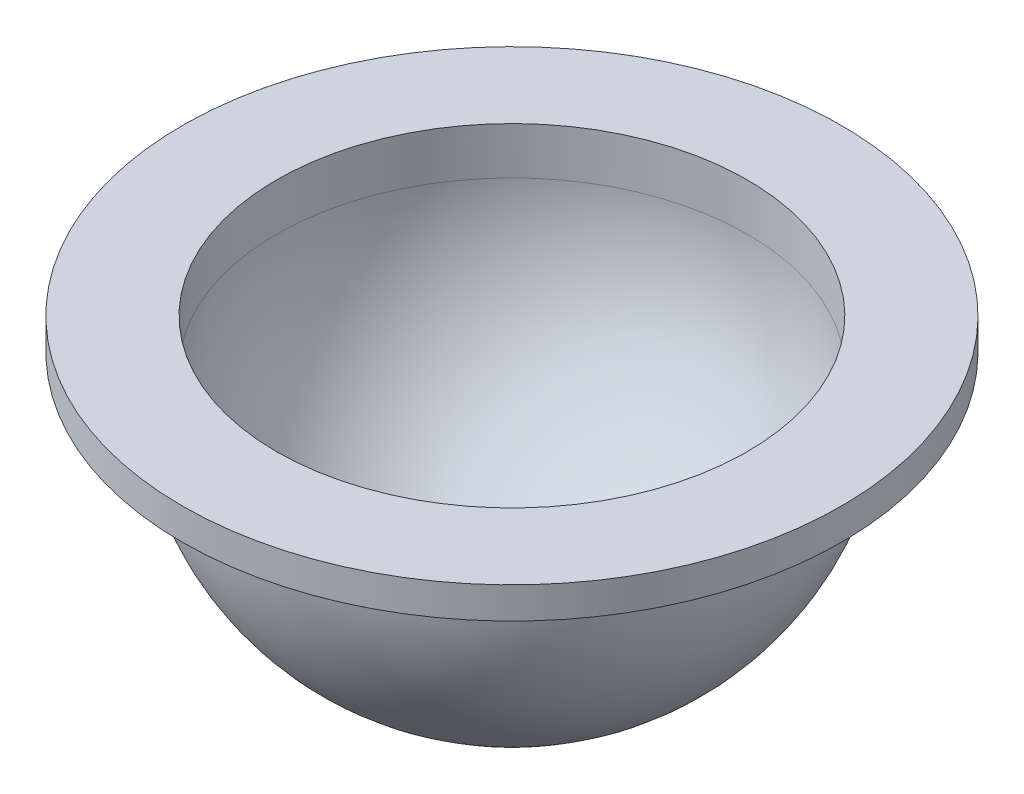
ISO-10303-21;
HEADER;
FILE_DESCRIPTION(('STEP AP214'),'2;1');
FILE_NAME('part.step','',(''),(''),'','','');
FILE_SCHEMA(('AUTOMOTIVE_DESIGN { 1 0 10303 214 1 1 1 1 }'));
ENDSEC;
DATA;
#1=APPLICATION_CONTEXT('core data for automotive mechanical design processes');
#2=APPLICATION_PROTOCOL_DEFINITION('international standard','automotive_design',2000,#1);
#3=PRODUCT_CONTEXT('',#1,'mechanical');
#4=PRODUCT('Part','Part','',(#3));
#5=PRODUCT_RELATED_PRODUCT_CATEGORY('part','',(#4));
#6=PRODUCT_DEFINITION_FORMATION('','',#4);
#7=PRODUCT_DEFINITION_CONTEXT('part definition',#1,'design');
#8=PRODUCT_DEFINITION('design','',#6,#7);
#9=PRODUCT_DEFINITION_SHAPE('','',#8);
#10=(LENGTH_UNIT() NAMED_UNIT(*) SI_UNIT(.MILLI.,.METRE.));
#11=(NAMED_UNIT(*) PLANE_ANGLE_UNIT() SI_UNIT($,.RADIAN.));
#12=(NAMED_UNIT(*) SI_UNIT($,.STERADIAN.) SOLID_ANGLE_UNIT());
#13=UNCERTAINTY_MEASURE_WITH_UNIT(LENGTH_MEASURE(1.E-05),#10,'distance_accuracy_value','');
#14=(GEOMETRIC_REPRESENTATION_CONTEXT(3) GLOBAL_UNCERTAINTY_ASSIGNED_CONTEXT((#13)) GLOBAL_UNIT_ASSIGNED_CONTEXT((#10,
#11,#12)) REPRESENTATION_CONTEXT('',''));
#15=CARTESIAN_POINT('',(0.,0.,0.));
#16=DIRECTION('',(0.,0.,1.));
#17=DIRECTION('',(1.,0.,0.));
#18=AXIS2_PLACEMENT_3D('',#15,#16,#17);
#19=CARTESIAN_POINT('',(0.,0.,-6.));
#20=DIRECTION('',(0.,1.,0.));
#21=DIRECTION('',(0.,0.,1.));
#22=AXIS2_PLACEMENT_3D('',#19,#20,#21);
#23=PLANE('',#22);
#24=CARTESIAN_POINT('',(0.,0.,-21.));
#25=DIRECTION('',(0.,1.,0.));
#26=DIRECTION('',(0.,0.,1.));
#27=AXIS2_PLACEMENT_3D('',#24,#25,#26);
#28=CIRCLE('',#27,21.);
#29=CARTESIAN_POINT('',(0.,0.,0.));
#30=VERTEX_POINT('',#29);
#31=EDGE_CURVE('E10',#30,#30,#28,.T.);
#32=ORIENTED_EDGE('',*,*,#31,.T.);
#33=EDGE_LOOP('',(#32));
#34=FACE_BOUND('',#33,.T.);
#35=CARTESIAN_POINT('',(0.,0.,-21.));
#36=DIRECTION('',(0.,1.,0.));
#37=DIRECTION('',(0.,0.,1.));
#38=AXIS2_PLACEMENT_3D('',#35,#36,#37);
#39=CIRCLE('',#38,15.);
#40=CARTESIAN_POINT('',(0.,0.,-6.));
#41=VERTEX_POINT('',#40);
#42=EDGE_CURVE('E61',#41,#41,#39,.T.);
#43=ORIENTED_EDGE('',*,*,#42,.F.);
#44=EDGE_LOOP('',(#43));
#45=FACE_BOUND('',#44,.T.);
#46=ADVANCED_FACE('F39',(#34,#45),#23,.T.);
#47=CARTESIAN_POINT('',(0.,28.1302952602436,-21.));
#48=DIRECTION('',(0.,1.,0.));
#49=DIRECTION('',(0.,0.,1.));
#50=AXIS2_PLACEMENT_3D('',#47,#48,#49);
#51=CYLINDRICAL_SURFACE('',#50,21.);
#52=CARTESIAN_POINT('',(0.,-2.,-21.));
#53=DIRECTION('',(0.,1.,0.));
#54=DIRECTION('',(0.,0.,1.));
#55=AXIS2_PLACEMENT_3D('',#52,#53,#54);
#56=CIRCLE('',#55,21.);
#57=CARTESIAN_POINT('',(0.,-2.,0.));
#58=VERTEX_POINT('',#57);
#59=EDGE_CURVE('E45',#58,#58,#56,.T.);
#60=ORIENTED_EDGE('',*,*,#59,.T.);
#61=EDGE_LOOP('',(#60));
#62=FACE_BOUND('',#61,.T.);
#63=ORIENTED_EDGE('',*,*,#31,.F.);
#64=EDGE_LOOP('',(#63));
#65=FACE_BOUND('',#64,.T.);
#66=ADVANCED_FACE('F69',(#62,#65),#51,.T.);
#67=CARTESIAN_POINT('',(0.,-2.,0.));
#68=DIRECTION('',(0.,-1.,0.));
#69=DIRECTION('',(0.,0.,-1.));
#70=AXIS2_PLACEMENT_3D('',#67,#68,#69);
#71=PLANE('',#70);
#72=CARTESIAN_POINT('',(0.,-2.,-21.));
#73=DIRECTION('',(0.,1.,0.));
#74=DIRECTION('',(0.,0.,1.));
#75=AXIS2_PLACEMENT_3D('',#72,#73,#74);
#76=CIRCLE('',#75,17.);
#77=CARTESIAN_POINT('',(0.,-2.,-4.));
#78=VERTEX_POINT('',#77);
#79=EDGE_CURVE('E49',#78,#78,#76,.T.);
#80=ORIENTED_EDGE('',*,*,#79,.T.);
#81=EDGE_LOOP('',(#80));
#82=FACE_BOUND('',#81,.T.);
#83=ORIENTED_EDGE('',*,*,#59,.F.);
#84=EDGE_LOOP('',(#83));
#85=FACE_BOUND('',#84,.T.);
#86=ADVANCED_FACE('F73',(#82,#85),#71,.T.);
#87=CARTESIAN_POINT('',(0.,28.1302952602436,-21.));
#88=DIRECTION('',(0.,1.,0.));
#89=DIRECTION('',(0.,0.,1.));
#90=AXIS2_PLACEMENT_3D('',#87,#88,#89);
#91=CYLINDRICAL_SURFACE('',#90,17.);
#92=CARTESIAN_POINT('',(0.,-3.,-21.));
#93=DIRECTION('',(0.,1.,0.));
#94=DIRECTION('',(0.,0.,1.));
#95=AXIS2_PLACEMENT_3D('',#92,#93,#94);
#96=CIRCLE('',#95,17.);
#97=CARTESIAN_POINT('',(0.,-3.,-4.00000000000001));
#98=VERTEX_POINT('',#97);
#99=EDGE_CURVE('E53',#98,#98,#96,.T.);
#100=ORIENTED_EDGE('',*,*,#99,.T.);
#101=EDGE_LOOP('',(#100));
#102=FACE_BOUND('',#101,.T.);
#103=ORIENTED_EDGE('',*,*,#79,.F.);
#104=EDGE_LOOP('',(#103));
#105=FACE_BOUND('',#104,.T.);
#106=ADVANCED_FACE('F77',(#102,#105),#91,.T.);
#107=CARTESIAN_POINT('',(0.,-3.,-21.));
#108=DIRECTION('',(0.,1.,0.));
#109=DIRECTION('',(0.,0.,1.));
#110=AXIS2_PLACEMENT_3D('',#107,#108,#109);
#111=SPHERICAL_SURFACE('',#110,17.);
#112=ORIENTED_EDGE('',*,*,#99,.F.);
#113=EDGE_LOOP('',(#112));
#114=FACE_BOUND('',#113,.T.);
#115=ADVANCED_FACE('F84',(#114),#111,.T.);
#116=CARTESIAN_POINT('',(0.,-3.,-21.));
#117=DIRECTION('',(0.,1.,0.));
#118=DIRECTION('',(0.,0.,-1.));
#119=AXIS2_PLACEMENT_3D('',#116,#117,#118);
#120=SPHERICAL_SURFACE('',#119,15.);
#121=CARTESIAN_POINT('',(0.,-3.,-21.));
#122=DIRECTION('',(0.,1.,0.));
#123=DIRECTION('',(0.,0.,1.));
#124=AXIS2_PLACEMENT_3D('',#121,#122,#123);
#125=CIRCLE('',#124,15.);
#126=CARTESIAN_POINT('',(0.,-3.,-6.00000000000001));
#127=VERTEX_POINT('',#126);
#128=EDGE_CURVE('E58',#127,#127,#125,.T.);
#129=ORIENTED_EDGE('',*,*,#128,.T.);
#130=EDGE_LOOP('',(#129));
#131=FACE_BOUND('',#130,.T.);
#132=ADVANCED_FACE('F88',(#131),#120,.F.);
#133=CARTESIAN_POINT('',(0.,28.1302952602436,-21.));
#134=DIRECTION('',(0.,1.,0.));
#135=DIRECTION('',(0.,0.,1.));
#136=AXIS2_PLACEMENT_3D('',#133,#134,#135);
#137=CYLINDRICAL_SURFACE('',#136,15.);
#138=ORIENTED_EDGE('',*,*,#42,.T.);
#139=EDGE_LOOP('',(#138));
#140=FACE_BOUND('',#139,.T.);
#141=ORIENTED_EDGE('',*,*,#128,.F.);
#142=EDGE_LOOP('',(#141));
#143=FACE_BOUND('',#142,.T.);
#144=ADVANCED_FACE('F65',(#140,#143),#137,.F.);
#145=CLOSED_SHELL('',(#46,#66,#86,#106,#115,#132,#144));
#146=MANIFOLD_SOLID_BREP('B2',#145);
#147=ADVANCED_BREP_SHAPE_REPRESENTATION('',(#18,#146),#14);
#148=SHAPE_DEFINITION_REPRESENTATION(#9,#147);
ENDSEC;
END-ISO-10303-21;
